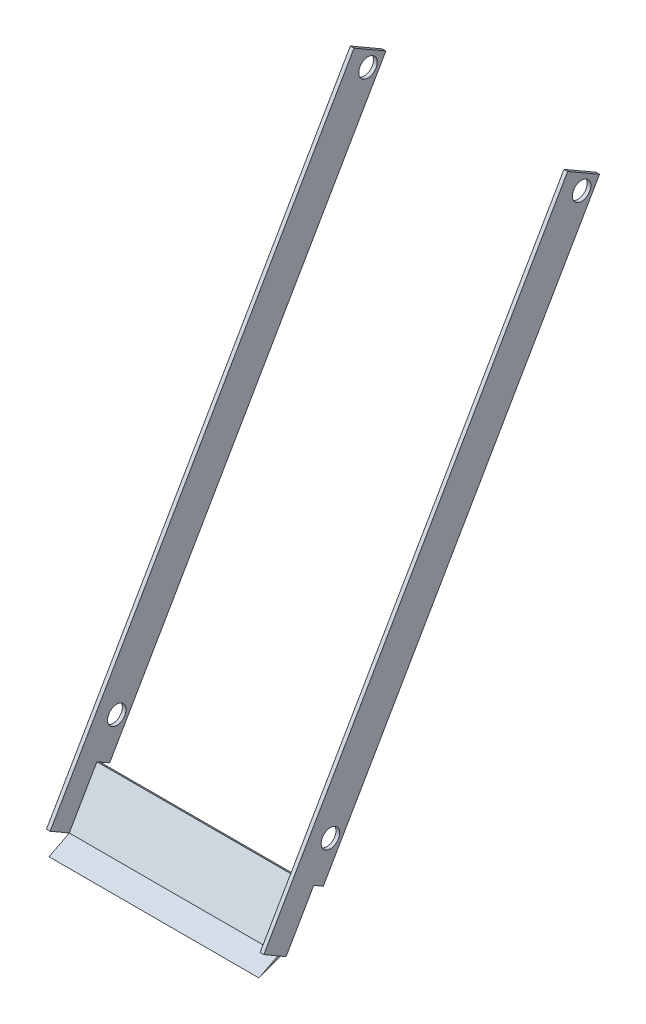
ISO-10303-21;
HEADER;
FILE_DESCRIPTION(('STEP AP214'),'2;1');
FILE_NAME('part.step','',(''),(''),'','','');
FILE_SCHEMA(('AUTOMOTIVE_DESIGN { 1 0 10303 214 1 1 1 1 }'));
ENDSEC;
DATA;
#1=APPLICATION_CONTEXT('core data for automotive mechanical design processes');
#2=APPLICATION_PROTOCOL_DEFINITION('international standard','automotive_design',2000,#1);
#3=PRODUCT_CONTEXT('',#1,'mechanical');
#4=PRODUCT('Part','Part','',(#3));
#5=PRODUCT_RELATED_PRODUCT_CATEGORY('part','',(#4));
#6=PRODUCT_DEFINITION_FORMATION('','',#4);
#7=PRODUCT_DEFINITION_CONTEXT('part definition',#1,'design');
#8=PRODUCT_DEFINITION('design','',#6,#7);
#9=PRODUCT_DEFINITION_SHAPE('','',#8);
#10=(LENGTH_UNIT() NAMED_UNIT(*) SI_UNIT(.MILLI.,.METRE.));
#11=(NAMED_UNIT(*) PLANE_ANGLE_UNIT() SI_UNIT($,.RADIAN.));
#12=(NAMED_UNIT(*) SI_UNIT($,.STERADIAN.) SOLID_ANGLE_UNIT());
#13=UNCERTAINTY_MEASURE_WITH_UNIT(LENGTH_MEASURE(1.E-05),#10,'distance_accuracy_value','');
#14=(GEOMETRIC_REPRESENTATION_CONTEXT(3) GLOBAL_UNCERTAINTY_ASSIGNED_CONTEXT((#13)) GLOBAL_UNIT_ASSIGNED_CONTEXT((#10,
#11,#12)) REPRESENTATION_CONTEXT('',''));
#15=CARTESIAN_POINT('',(0.,0.,0.));
#16=DIRECTION('',(0.,0.,1.));
#17=DIRECTION('',(1.,0.,0.));
#18=AXIS2_PLACEMENT_3D('',#15,#16,#17);
#19=CARTESIAN_POINT('',(1140.,-4.99999999999966,-8.66025403784386));
#20=DIRECTION('',(0.,-0.499999999999998,-0.86602540378444));
#21=DIRECTION('',(0.,0.86602540378444,-0.499999999999998));
#22=AXIS2_PLACEMENT_3D('',#19,#20,#21);
#23=PLANE('',#22);
#24=DIRECTION('',(0.,-0.86602540378444,0.499999999999998));
#25=VECTOR('',#24,1.);
#26=CARTESIAN_POINT('',(-20.,-5.04103145921631,-8.63656451381988));
#27=LINE('',#26,#25);
#28=CARTESIAN_POINT('',(-20.,254.807621135332,-158.660254037843));
#29=VERTEX_POINT('',#28);
#30=CARTESIAN_POINT('',(-20.,-5.04103145921631,-8.63656451381988));
#31=VERTEX_POINT('',#30);
#32=EDGE_CURVE('E144',#29,#31,#27,.T.);
#33=ORIENTED_EDGE('',*,*,#32,.F.);
#34=DIRECTION('',(-1.,0.,0.));
#35=VECTOR('',#34,1.);
#36=CARTESIAN_POINT('',(0.,254.807621135332,-158.660254037843));
#37=LINE('',#36,#35);
#38=CARTESIAN_POINT('',(0.,254.807621135332,-158.660254037843));
#39=VERTEX_POINT('',#38);
#40=EDGE_CURVE('E280',#39,#29,#37,.T.);
#41=ORIENTED_EDGE('',*,*,#40,.F.);
#42=DIRECTION('',(-1.,0.,0.));
#43=VECTOR('',#42,1.);
#44=CARTESIAN_POINT('',(1140.,254.807621135332,-158.660254037843));
#45=LINE('',#44,#43);
#46=CARTESIAN_POINT('',(1140.,254.807621135332,-158.660254037843));
#47=VERTEX_POINT('',#46);
#48=EDGE_CURVE('E112',#47,#39,#45,.T.);
#49=ORIENTED_EDGE('',*,*,#48,.F.);
#50=DIRECTION('',(-1.,0.,0.));
#51=VECTOR('',#50,1.);
#52=CARTESIAN_POINT('',(1160.,254.807621135332,-158.660254037843));
#53=LINE('',#52,#51);
#54=CARTESIAN_POINT('',(1160.,254.807621135332,-158.660254037843));
#55=VERTEX_POINT('',#54);
#56=EDGE_CURVE('E283',#55,#47,#53,.T.);
#57=ORIENTED_EDGE('',*,*,#56,.F.);
#58=DIRECTION('',(0.,0.86602540378444,-0.499999999999998));
#59=VECTOR('',#58,1.);
#60=CARTESIAN_POINT('',(1160.,-5.04103145921631,-8.63656451381988));
#61=LINE('',#60,#59);
#62=CARTESIAN_POINT('',(1160.,-5.04103145921631,-8.63656451381988));
#63=VERTEX_POINT('',#62);
#64=EDGE_CURVE('E166',#63,#55,#61,.T.);
#65=ORIENTED_EDGE('',*,*,#64,.F.);
#66=DIRECTION('',(-1.,0.,0.));
#67=VECTOR('',#66,1.);
#68=CARTESIAN_POINT('',(1160.,-5.04103145921631,-8.63656451381988));
#69=LINE('',#68,#67);
#70=CARTESIAN_POINT('',(1140.,-5.04103145921631,-8.63656451381988));
#71=VERTEX_POINT('',#70);
#72=EDGE_CURVE('E175',#63,#71,#69,.T.);
#73=ORIENTED_EDGE('',*,*,#72,.T.);
#74=DIRECTION('',(-1.,0.,0.));
#75=VECTOR('',#74,1.);
#76=CARTESIAN_POINT('',(1140.,-5.04103145921631,-8.63656451381988));
#77=LINE('',#76,#75);
#78=CARTESIAN_POINT('',(0.,-5.04103145921631,-8.63656451381988));
#79=VERTEX_POINT('',#78);
#80=EDGE_CURVE('E45',#71,#79,#77,.T.);
#81=ORIENTED_EDGE('',*,*,#80,.T.);
#82=DIRECTION('',(1.,0.,0.));
#83=VECTOR('',#82,1.);
#84=CARTESIAN_POINT('',(-20.,-5.04103145921631,-8.63656451381988));
#85=LINE('',#84,#83);
#86=EDGE_CURVE('E161',#31,#79,#85,.T.);
#87=ORIENTED_EDGE('',*,*,#86,.F.);
#88=EDGE_LOOP('',(#33,#41,#49,#57,#65,#73,#81,#87));
#89=FACE_BOUND('',#88,.T.);
#90=ADVANCED_FACE('F41',(#89),#23,.T.);
#91=CARTESIAN_POINT('',(1140.,259.807621135332,-149.999999999999));
#92=DIRECTION('',(0.,-0.86602540378444,0.499999999999998));
#93=DIRECTION('',(0.,-0.499999999999998,-0.86602540378444));
#94=AXIS2_PLACEMENT_3D('',#91,#92,#93);
#95=PLANE('',#94);
#96=DIRECTION('',(0.,-0.499999999999998,-0.86602540378444));
#97=VECTOR('',#96,1.);
#98=CARTESIAN_POINT('',(0.,324.807621135332,-37.4166975080214));
#99=LINE('',#98,#97);
#100=CARTESIAN_POINT('',(0.,264.807621135332,-141.339745962155));
#101=VERTEX_POINT('',#100);
#102=EDGE_CURVE('E108',#101,#39,#99,.T.);
#103=ORIENTED_EDGE('',*,*,#102,.F.);
#104=DIRECTION('',(-1.,0.,0.));
#105=VECTOR('',#104,1.);
#106=CARTESIAN_POINT('',(1140.,264.807621135331,-141.339745962156));
#107=LINE('',#106,#105);
#108=CARTESIAN_POINT('',(1140.,264.807621135331,-141.339745962156));
#109=VERTEX_POINT('',#108);
#110=EDGE_CURVE('E98',#109,#101,#107,.T.);
#111=ORIENTED_EDGE('',*,*,#110,.F.);
#112=DIRECTION('',(0.,0.499999999999998,0.86602540378444));
#113=VECTOR('',#112,1.);
#114=CARTESIAN_POINT('',(1140.,324.807621135332,-37.4166975080214));
#115=LINE('',#114,#113);
#116=EDGE_CURVE('E104',#47,#109,#115,.T.);
#117=ORIENTED_EDGE('',*,*,#116,.F.);
#118=ORIENTED_EDGE('',*,*,#48,.T.);
#119=EDGE_LOOP('',(#103,#111,#117,#118));
#120=FACE_BOUND('',#119,.T.);
#121=ADVANCED_FACE('F100',(#120),#95,.F.);
#122=CARTESIAN_POINT('',(0.,0.,0.));
#123=DIRECTION('',(1.,0.,0.));
#124=DIRECTION('',(0.,0.,-1.));
#125=AXIS2_PLACEMENT_3D('',#122,#123,#124);
#126=PLANE('',#125);
#127=DIRECTION('',(0.,0.499999999999997,0.86602540378444));
#128=VECTOR('',#127,1.);
#129=CARTESIAN_POINT('',(0.,64.9589685407834,112.606992016002));
#130=LINE('',#129,#128);
#131=CARTESIAN_POINT('',(0.,4.95896854078304,8.68394356186788));
#132=VERTEX_POINT('',#131);
#133=EDGE_CURVE('E72',#79,#132,#130,.T.);
#134=ORIENTED_EDGE('',*,*,#133,.F.);
#135=DIRECTION('',(0.,-0.346036376698013,0.938221096544791));
#136=VECTOR('',#135,1.);
#137=CARTESIAN_POINT('',(0.,-7.24134762664055,-2.67076673543316));
#138=LINE('',#137,#136);
#139=CARTESIAN_POINT('',(0.,-51.9835726598209,118.640466011402));
#140=VERTEX_POINT('',#139);
#141=EDGE_CURVE('E178',#79,#140,#138,.T.);
#142=ORIENTED_EDGE('',*,*,#141,.T.);
#143=DIRECTION('',(0.,-0.459859155191611,0.887991867860544));
#144=VECTOR('',#143,1.);
#145=CARTESIAN_POINT('',(0.,7.45639195742674,3.86139809431034));
#146=LINE('',#145,#144);
#147=EDGE_CURVE('E180',#132,#140,#146,.T.);
#148=ORIENTED_EDGE('',*,*,#147,.F.);
#149=EDGE_LOOP('',(#134,#142,#148));
#150=FACE_BOUND('',#149,.T.);
#151=ADVANCED_FACE('F342',(#150),#126,.F.);
#152=CARTESIAN_POINT('',(1140.,-7.24134762664055,-2.67076673543316));
#153=DIRECTION('',(0.,-0.938221096544791,-0.346036376698013));
#154=DIRECTION('',(0.,0.346036376698013,-0.938221096544791));
#155=AXIS2_PLACEMENT_3D('',#152,#153,#154);
#156=PLANE('',#155);
#157=ORIENTED_EDGE('',*,*,#141,.F.);
#158=ORIENTED_EDGE('',*,*,#80,.F.);
#159=DIRECTION('',(0.,-0.346036376698013,0.938221096544791));
#160=VECTOR('',#159,1.);
#161=CARTESIAN_POINT('',(1140.,-7.24134762664055,-2.67076673543316));
#162=LINE('',#161,#160);
#163=CARTESIAN_POINT('',(1140.,-51.9835726598209,118.640466011402));
#164=VERTEX_POINT('',#163);
#165=EDGE_CURVE('E123',#71,#164,#162,.T.);
#166=ORIENTED_EDGE('',*,*,#165,.T.);
#167=DIRECTION('',(-1.,0.,0.));
#168=VECTOR('',#167,1.);
#169=CARTESIAN_POINT('',(1140.,-51.9835726598209,118.640466011402));
#170=LINE('',#169,#168);
#171=EDGE_CURVE('E183',#164,#140,#170,.T.);
#172=ORIENTED_EDGE('',*,*,#171,.T.);
#173=EDGE_LOOP('',(#157,#158,#166,#172));
#174=FACE_BOUND('',#173,.T.);
#175=ADVANCED_FACE('F43',(#174),#156,.T.);
#176=CARTESIAN_POINT('',(1140.,4.99999999999968,8.66025403784388));
#177=DIRECTION('',(0.,-0.499999999999998,-0.86602540378444));
#178=DIRECTION('',(0.,0.86602540378444,-0.499999999999998));
#179=AXIS2_PLACEMENT_3D('',#176,#177,#178);
#180=PLANE('',#179);
#181=DIRECTION('',(0.,-0.86602540378444,0.499999999999998));
#182=VECTOR('',#181,1.);
#183=CARTESIAN_POINT('',(0.,4.99999999999968,8.66025403784388));
#184=LINE('',#183,#182);
#185=EDGE_CURVE('E185',#101,#132,#184,.T.);
#186=ORIENTED_EDGE('',*,*,#185,.T.);
#187=DIRECTION('',(-1.,0.,0.));
#188=VECTOR('',#187,1.);
#189=CARTESIAN_POINT('',(1140.,4.95896854078302,8.68394356186786));
#190=LINE('',#189,#188);
#191=CARTESIAN_POINT('',(1140.,4.95896854078302,8.68394356186786));
#192=VERTEX_POINT('',#191);
#193=EDGE_CURVE('E113',#192,#132,#190,.T.);
#194=ORIENTED_EDGE('',*,*,#193,.F.);
#195=DIRECTION('',(0.,-0.86602540378444,0.499999999999998));
#196=VECTOR('',#195,1.);
#197=CARTESIAN_POINT('',(1140.,4.99999999999968,8.66025403784388));
#198=LINE('',#197,#196);
#199=EDGE_CURVE('E117',#109,#192,#198,.T.);
#200=ORIENTED_EDGE('',*,*,#199,.F.);
#201=ORIENTED_EDGE('',*,*,#110,.T.);
#202=EDGE_LOOP('',(#186,#194,#200,#201));
#203=FACE_BOUND('',#202,.T.);
#204=ADVANCED_FACE('F118',(#203),#180,.F.);
#205=CARTESIAN_POINT('',(1140.,7.45639195742674,3.86139809431034));
#206=DIRECTION('',(0.,-0.887991867860544,-0.459859155191611));
#207=DIRECTION('',(0.,0.459859155191611,-0.887991867860544));
#208=AXIS2_PLACEMENT_3D('',#205,#206,#207);
#209=PLANE('',#208);
#210=ORIENTED_EDGE('',*,*,#147,.T.);
#211=ORIENTED_EDGE('',*,*,#171,.F.);
#212=DIRECTION('',(0.,-0.459859155191611,0.887991867860544));
#213=VECTOR('',#212,1.);
#214=CARTESIAN_POINT('',(1140.,7.45639195742674,3.86139809431034));
#215=LINE('',#214,#213);
#216=EDGE_CURVE('E60',#192,#164,#215,.T.);
#217=ORIENTED_EDGE('',*,*,#216,.F.);
#218=ORIENTED_EDGE('',*,*,#193,.T.);
#219=EDGE_LOOP('',(#210,#211,#217,#218));
#220=FACE_BOUND('',#219,.T.);
#221=ADVANCED_FACE('F326',(#220),#209,.F.);
#222=CARTESIAN_POINT('',(1140.,0.,0.));
#223=DIRECTION('',(1.,0.,0.));
#224=DIRECTION('',(0.,0.,-1.));
#225=AXIS2_PLACEMENT_3D('',#222,#223,#224);
#226=PLANE('',#225);
#227=DIRECTION('',(0.,-0.499999999999997,-0.86602540378444));
#228=VECTOR('',#227,1.);
#229=CARTESIAN_POINT('',(1140.,-5.04103145921631,-8.63656451381988));
#230=LINE('',#229,#228);
#231=EDGE_CURVE('E11',#192,#71,#230,.T.);
#232=ORIENTED_EDGE('',*,*,#231,.F.);
#233=ORIENTED_EDGE('',*,*,#216,.T.);
#234=ORIENTED_EDGE('',*,*,#165,.F.);
#235=EDGE_LOOP('',(#232,#233,#234));
#236=FACE_BOUND('',#235,.T.);
#237=ADVANCED_FACE('F324',(#236),#226,.T.);
#238=CARTESIAN_POINT('',(1160.,-5.04103145921631,-8.63656451381988));
#239=DIRECTION('',(0.,0.86602540378444,-0.499999999999998));
#240=DIRECTION('',(0.,0.499999999999998,0.86602540378444));
#241=AXIS2_PLACEMENT_3D('',#238,#239,#240);
#242=PLANE('',#241);
#243=CARTESIAN_POINT('',(1140.,64.9589685407834,112.606992016002));
#244=VERTEX_POINT('',#243);
#245=EDGE_CURVE('E52',#244,#192,#230,.T.);
#246=ORIENTED_EDGE('',*,*,#245,.T.);
#247=ORIENTED_EDGE('',*,*,#231,.T.);
#248=ORIENTED_EDGE('',*,*,#72,.F.);
#249=DIRECTION('',(0.,-0.499999999999997,-0.86602540378444));
#250=VECTOR('',#249,1.);
#251=CARTESIAN_POINT('',(1160.,-5.04103145921631,-8.63656451381988));
#252=LINE('',#251,#250);
#253=CARTESIAN_POINT('',(1160.,64.9589685407834,112.606992016002));
#254=VERTEX_POINT('',#253);
#255=EDGE_CURVE('E164',#254,#63,#252,.T.);
#256=ORIENTED_EDGE('',*,*,#255,.F.);
#257=DIRECTION('',(-1.,0.,0.));
#258=VECTOR('',#257,1.);
#259=CARTESIAN_POINT('',(1160.,64.9589685407834,112.606992016002));
#260=LINE('',#259,#258);
#261=EDGE_CURVE('E170',#254,#244,#260,.T.);
#262=ORIENTED_EDGE('',*,*,#261,.T.);
#263=EDGE_LOOP('',(#246,#247,#248,#256,#262));
#264=FACE_BOUND('',#263,.T.);
#265=ADVANCED_FACE('F323',(#264),#242,.F.);
#266=CARTESIAN_POINT('',(1160.,64.9589685407834,112.606992016002));
#267=DIRECTION('',(0.,-0.499999999999998,-0.86602540378444));
#268=DIRECTION('',(0.,0.86602540378444,-0.499999999999998));
#269=AXIS2_PLACEMENT_3D('',#266,#267,#268);
#270=PLANE('',#269);
#271=DIRECTION('',(0.,-0.86602540378444,0.499999999999997));
#272=VECTOR('',#271,1.);
#273=CARTESIAN_POINT('',(1140.,64.9589685407834,112.606992016002));
#274=LINE('',#273,#272);
#275=CARTESIAN_POINT('',(1140.,2922.71062740789,-1537.31669750802));
#276=VERTEX_POINT('',#275);
#277=EDGE_CURVE('E167',#276,#244,#274,.T.);
#278=ORIENTED_EDGE('',*,*,#277,.T.);
#279=ORIENTED_EDGE('',*,*,#261,.F.);
#280=DIRECTION('',(0.,-0.86602540378444,0.499999999999997));
#281=VECTOR('',#280,1.);
#282=CARTESIAN_POINT('',(1160.,64.9589685407834,112.606992016002));
#283=LINE('',#282,#281);
#284=CARTESIAN_POINT('',(1160.,2922.71062740789,-1537.31669750802));
#285=VERTEX_POINT('',#284);
#286=EDGE_CURVE('E82',#285,#254,#283,.T.);
#287=ORIENTED_EDGE('',*,*,#286,.F.);
#288=DIRECTION('',(1.,0.,0.));
#289=VECTOR('',#288,1.);
#290=CARTESIAN_POINT('',(1160.,2922.71062740789,-1537.31669750802));
#291=LINE('',#290,#289);
#292=EDGE_CURVE('E131',#276,#285,#291,.T.);
#293=ORIENTED_EDGE('',*,*,#292,.F.);
#294=EDGE_LOOP('',(#278,#279,#287,#293));
#295=FACE_BOUND('',#294,.T.);
#296=ADVANCED_FACE('F312',(#295),#270,.F.);
#297=CARTESIAN_POINT('',(1160.,0.,0.));
#298=DIRECTION('',(-1.,0.,0.));
#299=DIRECTION('',(0.,0.,1.));
#300=AXIS2_PLACEMENT_3D('',#297,#298,#299);
#301=PLANE('',#300);
#302=CARTESIAN_POINT('',(1160.,431.627061246165,-249.199999999999));
#303=DIRECTION('',(1.,0.,0.));
#304=DIRECTION('',(0.,0.,-1.));
#305=AXIS2_PLACEMENT_3D('',#302,#303,#304);
#306=CIRCLE('',#305,50.);
#307=CARTESIAN_POINT('',(1160.,431.627061246165,-299.199999999999));
#308=VERTEX_POINT('',#307);
#309=EDGE_CURVE('E595',#308,#308,#306,.T.);
#310=ORIENTED_EDGE('',*,*,#309,.F.);
#311=EDGE_LOOP('',(#310));
#312=FACE_BOUND('',#311,.T.);
#313=CARTESIAN_POINT('',(1160.,2794.14436277011,-1613.2));
#314=DIRECTION('',(1.,0.,0.));
#315=DIRECTION('',(0.,0.,-1.));
#316=AXIS2_PLACEMENT_3D('',#313,#314,#315);
#317=CIRCLE('',#316,50.);
#318=CARTESIAN_POINT('',(1160.,2794.14436277011,-1663.2));
#319=VERTEX_POINT('',#318);
#320=EDGE_CURVE('E603',#319,#319,#317,.T.);
#321=ORIENTED_EDGE('',*,*,#320,.F.);
#322=EDGE_LOOP('',(#321));
#323=FACE_BOUND('',#322,.T.);
#324=ORIENTED_EDGE('',*,*,#255,.T.);
#325=ORIENTED_EDGE('',*,*,#64,.T.);
#326=DIRECTION('',(0.,0.499999999999998,0.86602540378444));
#327=VECTOR('',#326,1.);
#328=CARTESIAN_POINT('',(1160.,224.807621135332,-210.621778264909));
#329=LINE('',#328,#327);
#330=CARTESIAN_POINT('',(1160.,224.807621135332,-210.621778264909));
#331=VERTEX_POINT('',#330);
#332=EDGE_CURVE('E301',#331,#55,#329,.T.);
#333=ORIENTED_EDGE('',*,*,#332,.F.);
#334=DIRECTION('',(0.,-0.86602540378444,0.499999999999998));
#335=VECTOR('',#334,1.);
#336=CARTESIAN_POINT('',(1160.,2822.7106274079,-1710.5217782649));
#337=LINE('',#336,#335);
#338=CARTESIAN_POINT('',(1160.,2822.7106274079,-1710.5217782649));
#339=VERTEX_POINT('',#338);
#340=EDGE_CURVE('E285',#339,#331,#337,.T.);
#341=ORIENTED_EDGE('',*,*,#340,.F.);
#342=DIRECTION('',(0.,-0.499999999999998,-0.86602540378444));
#343=VECTOR('',#342,1.);
#344=CARTESIAN_POINT('',(1160.,2852.71062740789,-1658.56025403784));
#345=LINE('',#344,#343);
#346=EDGE_CURVE('E135',#285,#339,#345,.T.);
#347=ORIENTED_EDGE('',*,*,#346,.F.);
#348=ORIENTED_EDGE('',*,*,#286,.T.);
#349=EDGE_LOOP('',(#324,#325,#333,#341,#347,#348));
#350=FACE_BOUND('',#349,.T.);
#351=ADVANCED_FACE('F315',(#312,#323,#350),#301,.F.);
#352=CARTESIAN_POINT('',(1140.,0.,0.));
#353=DIRECTION('',(-1.,0.,0.));
#354=DIRECTION('',(0.,0.,1.));
#355=AXIS2_PLACEMENT_3D('',#352,#353,#354);
#356=PLANE('',#355);
#357=CARTESIAN_POINT('',(1140.,431.627061246165,-249.199999999999));
#358=DIRECTION('',(-1.,0.,0.));
#359=DIRECTION('',(0.,0.,1.));
#360=AXIS2_PLACEMENT_3D('',#357,#358,#359);
#361=CIRCLE('',#360,50.);
#362=CARTESIAN_POINT('',(1140.,431.627061246165,-199.199999999999));
#363=VERTEX_POINT('',#362);
#364=EDGE_CURVE('E592',#363,#363,#361,.T.);
#365=ORIENTED_EDGE('',*,*,#364,.F.);
#366=EDGE_LOOP('',(#365));
#367=FACE_BOUND('',#366,.T.);
#368=CARTESIAN_POINT('',(1140.,2794.14436277011,-1613.2));
#369=DIRECTION('',(-1.,0.,0.));
#370=DIRECTION('',(0.,0.,1.));
#371=AXIS2_PLACEMENT_3D('',#368,#369,#370);
#372=CIRCLE('',#371,50.);
#373=CARTESIAN_POINT('',(1140.,2794.14436277011,-1563.2));
#374=VERTEX_POINT('',#373);
#375=EDGE_CURVE('E610',#374,#374,#372,.T.);
#376=ORIENTED_EDGE('',*,*,#375,.F.);
#377=EDGE_LOOP('',(#376));
#378=FACE_BOUND('',#377,.T.);
#379=ORIENTED_EDGE('',*,*,#277,.F.);
#380=DIRECTION('',(0.,0.499999999999998,0.86602540378444));
#381=VECTOR('',#380,1.);
#382=CARTESIAN_POINT('',(1140.,2922.71062740789,-1537.31669750802));
#383=LINE('',#382,#381);
#384=CARTESIAN_POINT('',(1140.,2822.7106274079,-1710.5217782649));
#385=VERTEX_POINT('',#384);
#386=EDGE_CURVE('E142',#385,#276,#383,.T.);
#387=ORIENTED_EDGE('',*,*,#386,.F.);
#388=DIRECTION('',(0.,0.86602540378444,-0.499999999999998));
#389=VECTOR('',#388,1.);
#390=CARTESIAN_POINT('',(1140.,2822.7106274079,-1710.5217782649));
#391=LINE('',#390,#389);
#392=CARTESIAN_POINT('',(1140.,224.807621135332,-210.621778264909));
#393=VERTEX_POINT('',#392);
#394=EDGE_CURVE('E294',#393,#385,#391,.T.);
#395=ORIENTED_EDGE('',*,*,#394,.F.);
#396=DIRECTION('',(0.,0.499999999999998,0.86602540378444));
#397=VECTOR('',#396,1.);
#398=CARTESIAN_POINT('',(1140.,224.807621135332,-210.621778264909));
#399=LINE('',#398,#397);
#400=EDGE_CURVE('E130',#393,#47,#399,.T.);
#401=ORIENTED_EDGE('',*,*,#400,.T.);
#402=ORIENTED_EDGE('',*,*,#116,.T.);
#403=ORIENTED_EDGE('',*,*,#199,.T.);
#404=ORIENTED_EDGE('',*,*,#245,.F.);
#405=EDGE_LOOP('',(#379,#387,#395,#401,#402,#403,#404));
#406=FACE_BOUND('',#405,.T.);
#407=ADVANCED_FACE('F127',(#367,#378,#406),#356,.T.);
#408=CARTESIAN_POINT('',(0.,0.,0.));
#409=DIRECTION('',(1.,0.,0.));
#410=DIRECTION('',(0.,0.,-1.));
#411=AXIS2_PLACEMENT_3D('',#408,#409,#410);
#412=PLANE('',#411);
#413=CARTESIAN_POINT('',(0.,431.627061246165,-249.199999999999));
#414=DIRECTION('',(1.,0.,0.));
#415=DIRECTION('',(0.,0.,-1.));
#416=AXIS2_PLACEMENT_3D('',#413,#414,#415);
#417=CIRCLE('',#416,50.);
#418=CARTESIAN_POINT('',(0.,431.627061246165,-299.199999999999));
#419=VERTEX_POINT('',#418);
#420=EDGE_CURVE('E613',#419,#419,#417,.T.);
#421=ORIENTED_EDGE('',*,*,#420,.F.);
#422=EDGE_LOOP('',(#421));
#423=FACE_BOUND('',#422,.T.);
#424=CARTESIAN_POINT('',(0.,2794.14436277011,-1613.2));
#425=DIRECTION('',(1.,0.,0.));
#426=DIRECTION('',(0.,0.,-1.));
#427=AXIS2_PLACEMENT_3D('',#424,#425,#426);
#428=CIRCLE('',#427,50.);
#429=CARTESIAN_POINT('',(0.,2794.14436277011,-1663.2));
#430=VERTEX_POINT('',#429);
#431=EDGE_CURVE('E600',#430,#430,#428,.T.);
#432=ORIENTED_EDGE('',*,*,#431,.F.);
#433=EDGE_LOOP('',(#432));
#434=FACE_BOUND('',#433,.T.);
#435=ORIENTED_EDGE('',*,*,#185,.F.);
#436=ORIENTED_EDGE('',*,*,#102,.T.);
#437=DIRECTION('',(0.,0.499999999999998,0.86602540378444));
#438=VECTOR('',#437,1.);
#439=CARTESIAN_POINT('',(0.,224.807621135332,-210.621778264909));
#440=LINE('',#439,#438);
#441=CARTESIAN_POINT('',(0.,224.807621135332,-210.621778264909));
#442=VERTEX_POINT('',#441);
#443=EDGE_CURVE('E264',#442,#39,#440,.T.);
#444=ORIENTED_EDGE('',*,*,#443,.F.);
#445=DIRECTION('',(0.,-0.86602540378444,0.499999999999998));
#446=VECTOR('',#445,1.);
#447=CARTESIAN_POINT('',(0.,2822.7106274079,-1710.5217782649));
#448=LINE('',#447,#446);
#449=CARTESIAN_POINT('',(0.,2822.7106274079,-1710.5217782649));
#450=VERTEX_POINT('',#449);
#451=EDGE_CURVE('E271',#450,#442,#448,.T.);
#452=ORIENTED_EDGE('',*,*,#451,.F.);
#453=DIRECTION('',(0.,-0.499999999999998,-0.86602540378444));
#454=VECTOR('',#453,1.);
#455=CARTESIAN_POINT('',(0.,2922.71062740789,-1537.31669750802));
#456=LINE('',#455,#454);
#457=CARTESIAN_POINT('',(0.,2922.71062740789,-1537.31669750802));
#458=VERTEX_POINT('',#457);
#459=EDGE_CURVE('E138',#458,#450,#456,.T.);
#460=ORIENTED_EDGE('',*,*,#459,.F.);
#461=DIRECTION('',(0.,0.86602540378444,-0.499999999999997));
#462=VECTOR('',#461,1.);
#463=CARTESIAN_POINT('',(0.,324.807621135332,-37.4166975080214));
#464=LINE('',#463,#462);
#465=CARTESIAN_POINT('',(0.,64.9589685407834,112.606992016002));
#466=VERTEX_POINT('',#465);
#467=EDGE_CURVE('E148',#466,#458,#464,.T.);
#468=ORIENTED_EDGE('',*,*,#467,.F.);
#469=EDGE_CURVE('E156',#132,#466,#130,.T.);
#470=ORIENTED_EDGE('',*,*,#469,.F.);
#471=EDGE_LOOP('',(#435,#436,#444,#452,#460,#468,#470));
#472=FACE_BOUND('',#471,.T.);
#473=ADVANCED_FACE('F282',(#423,#434,#472),#412,.T.);
#474=CARTESIAN_POINT('',(-20.,64.9589685407834,112.606992016002));
#475=DIRECTION('',(0.,0.86602540378444,-0.499999999999998));
#476=DIRECTION('',(0.,0.499999999999998,0.86602540378444));
#477=AXIS2_PLACEMENT_3D('',#474,#475,#476);
#478=PLANE('',#477);
#479=ORIENTED_EDGE('',*,*,#133,.T.);
#480=ORIENTED_EDGE('',*,*,#469,.T.);
#481=DIRECTION('',(1.,0.,0.));
#482=VECTOR('',#481,1.);
#483=CARTESIAN_POINT('',(-20.,64.9589685407834,112.606992016002));
#484=LINE('',#483,#482);
#485=CARTESIAN_POINT('',(-20.,64.9589685407834,112.606992016002));
#486=VERTEX_POINT('',#485);
#487=EDGE_CURVE('E154',#486,#466,#484,.T.);
#488=ORIENTED_EDGE('',*,*,#487,.F.);
#489=DIRECTION('',(0.,0.499999999999997,0.86602540378444));
#490=VECTOR('',#489,1.);
#491=CARTESIAN_POINT('',(-20.,64.9589685407834,112.606992016002));
#492=LINE('',#491,#490);
#493=EDGE_CURVE('E147',#31,#486,#492,.T.);
#494=ORIENTED_EDGE('',*,*,#493,.F.);
#495=ORIENTED_EDGE('',*,*,#86,.T.);
#496=EDGE_LOOP('',(#479,#480,#488,#494,#495));
#497=FACE_BOUND('',#496,.T.);
#498=ADVANCED_FACE('F201',(#497),#478,.F.);
#499=CARTESIAN_POINT('',(-20.,324.807621135332,-37.4166975080214));
#500=DIRECTION('',(0.,-0.499999999999998,-0.86602540378444));
#501=DIRECTION('',(0.,0.86602540378444,-0.499999999999998));
#502=AXIS2_PLACEMENT_3D('',#499,#500,#501);
#503=PLANE('',#502);
#504=ORIENTED_EDGE('',*,*,#467,.T.);
#505=DIRECTION('',(1.,0.,0.));
#506=VECTOR('',#505,1.);
#507=CARTESIAN_POINT('',(-20.,2922.71062740789,-1537.31669750802));
#508=LINE('',#507,#506);
#509=CARTESIAN_POINT('',(-20.,2922.71062740789,-1537.31669750802));
#510=VERTEX_POINT('',#509);
#511=EDGE_CURVE('E303',#510,#458,#508,.T.);
#512=ORIENTED_EDGE('',*,*,#511,.F.);
#513=DIRECTION('',(0.,0.86602540378444,-0.499999999999997));
#514=VECTOR('',#513,1.);
#515=CARTESIAN_POINT('',(-20.,324.807621135332,-37.4166975080214));
#516=LINE('',#515,#514);
#517=EDGE_CURVE('E151',#486,#510,#516,.T.);
#518=ORIENTED_EDGE('',*,*,#517,.F.);
#519=ORIENTED_EDGE('',*,*,#487,.T.);
#520=EDGE_LOOP('',(#504,#512,#518,#519));
#521=FACE_BOUND('',#520,.T.);
#522=ADVANCED_FACE('F406',(#521),#503,.F.);
#523=CARTESIAN_POINT('',(-20.,0.,0.));
#524=DIRECTION('',(1.,0.,0.));
#525=DIRECTION('',(0.,0.,-1.));
#526=AXIS2_PLACEMENT_3D('',#523,#524,#525);
#527=PLANE('',#526);
#528=CARTESIAN_POINT('',(-20.,431.627061246165,-249.199999999999));
#529=DIRECTION('',(1.,0.,0.));
#530=DIRECTION('',(0.,0.,-1.));
#531=AXIS2_PLACEMENT_3D('',#528,#529,#530);
#532=CIRCLE('',#531,50.);
#533=CARTESIAN_POINT('',(-20.,431.627061246165,-299.199999999999));
#534=VERTEX_POINT('',#533);
#535=EDGE_CURVE('E596',#534,#534,#532,.T.);
#536=ORIENTED_EDGE('',*,*,#535,.T.);
#537=EDGE_LOOP('',(#536));
#538=FACE_BOUND('',#537,.T.);
#539=CARTESIAN_POINT('',(-20.,2794.14436277011,-1613.2));
#540=DIRECTION('',(1.,0.,0.));
#541=DIRECTION('',(0.,0.,-1.));
#542=AXIS2_PLACEMENT_3D('',#539,#540,#541);
#543=CIRCLE('',#542,50.);
#544=CARTESIAN_POINT('',(-20.,2794.14436277011,-1663.2));
#545=VERTEX_POINT('',#544);
#546=EDGE_CURVE('E597',#545,#545,#543,.T.);
#547=ORIENTED_EDGE('',*,*,#546,.T.);
#548=EDGE_LOOP('',(#547));
#549=FACE_BOUND('',#548,.T.);
#550=DIRECTION('',(0.,0.499999999999998,0.86602540378444));
#551=VECTOR('',#550,1.);
#552=CARTESIAN_POINT('',(-20.,2922.71062740789,-1537.31669750802));
#553=LINE('',#552,#551);
#554=CARTESIAN_POINT('',(-20.,2822.7106274079,-1710.5217782649));
#555=VERTEX_POINT('',#554);
#556=EDGE_CURVE('E132',#555,#510,#553,.T.);
#557=ORIENTED_EDGE('',*,*,#556,.F.);
#558=DIRECTION('',(0.,0.86602540378444,-0.499999999999998));
#559=VECTOR('',#558,1.);
#560=CARTESIAN_POINT('',(-20.,2822.7106274079,-1710.5217782649));
#561=LINE('',#560,#559);
#562=CARTESIAN_POINT('',(-20.,224.807621135332,-210.621778264909));
#563=VERTEX_POINT('',#562);
#564=EDGE_CURVE('E270',#563,#555,#561,.T.);
#565=ORIENTED_EDGE('',*,*,#564,.F.);
#566=DIRECTION('',(0.,0.499999999999998,0.86602540378444));
#567=VECTOR('',#566,1.);
#568=CARTESIAN_POINT('',(-20.,224.807621135332,-210.621778264909));
#569=LINE('',#568,#567);
#570=EDGE_CURVE('E266',#563,#29,#569,.T.);
#571=ORIENTED_EDGE('',*,*,#570,.T.);
#572=ORIENTED_EDGE('',*,*,#32,.T.);
#573=ORIENTED_EDGE('',*,*,#493,.T.);
#574=ORIENTED_EDGE('',*,*,#517,.T.);
#575=EDGE_LOOP('',(#557,#565,#571,#572,#573,#574));
#576=FACE_BOUND('',#575,.T.);
#577=ADVANCED_FACE('F210',(#538,#549,#576),#527,.F.);
#578=CARTESIAN_POINT('',(0.,2857.71062740789,-1649.89999999999));
#579=DIRECTION('',(0.,-0.866025403784439,0.499999999999998));
#580=DIRECTION('',(0.,-0.499999999999998,-0.86602540378444));
#581=AXIS2_PLACEMENT_3D('',#578,#579,#580);
#582=PLANE('',#581);
#583=ORIENTED_EDGE('',*,*,#292,.T.);
#584=ORIENTED_EDGE('',*,*,#346,.T.);
#585=DIRECTION('',(1.,0.,0.));
#586=VECTOR('',#585,1.);
#587=CARTESIAN_POINT('',(1160.,2822.7106274079,-1710.5217782649));
#588=LINE('',#587,#586);
#589=EDGE_CURVE('E297',#385,#339,#588,.T.);
#590=ORIENTED_EDGE('',*,*,#589,.F.);
#591=ORIENTED_EDGE('',*,*,#386,.T.);
#592=EDGE_LOOP('',(#583,#584,#590,#591));
#593=FACE_BOUND('',#592,.T.);
#594=ADVANCED_FACE('F310',(#593),#582,.F.);
#595=CARTESIAN_POINT('',(0.,2857.71062740789,-1649.89999999999));
#596=DIRECTION('',(0.,0.86602540378444,-0.499999999999998));
#597=DIRECTION('',(0.,0.499999999999998,0.86602540378444));
#598=AXIS2_PLACEMENT_3D('',#595,#596,#597);
#599=PLANE('',#598);
#600=ORIENTED_EDGE('',*,*,#511,.T.);
#601=ORIENTED_EDGE('',*,*,#459,.T.);
#602=DIRECTION('',(1.,0.,0.));
#603=VECTOR('',#602,1.);
#604=CARTESIAN_POINT('',(0.,2822.7106274079,-1710.5217782649));
#605=LINE('',#604,#603);
#606=EDGE_CURVE('E277',#555,#450,#605,.T.);
#607=ORIENTED_EDGE('',*,*,#606,.F.);
#608=ORIENTED_EDGE('',*,*,#556,.T.);
#609=EDGE_LOOP('',(#600,#601,#607,#608));
#610=FACE_BOUND('',#609,.T.);
#611=ADVANCED_FACE('F461',(#610),#599,.T.);
#612=CARTESIAN_POINT('',(1160.,224.807621135332,-210.621778264909));
#613=DIRECTION('',(0.,0.86602540378444,-0.499999999999998));
#614=DIRECTION('',(0.,0.499999999999998,0.86602540378444));
#615=AXIS2_PLACEMENT_3D('',#612,#613,#614);
#616=PLANE('',#615);
#617=ORIENTED_EDGE('',*,*,#56,.T.);
#618=ORIENTED_EDGE('',*,*,#400,.F.);
#619=DIRECTION('',(-1.,0.,0.));
#620=VECTOR('',#619,1.);
#621=CARTESIAN_POINT('',(1160.,224.807621135332,-210.621778264909));
#622=LINE('',#621,#620);
#623=EDGE_CURVE('E292',#331,#393,#622,.T.);
#624=ORIENTED_EDGE('',*,*,#623,.F.);
#625=ORIENTED_EDGE('',*,*,#332,.T.);
#626=EDGE_LOOP('',(#617,#618,#624,#625));
#627=FACE_BOUND('',#626,.T.);
#628=ADVANCED_FACE('F320',(#627),#616,.F.);
#629=CARTESIAN_POINT('',(0.,-34.9999999999995,-60.6217782649103));
#630=DIRECTION('',(0.,-0.499999999999998,-0.86602540378444));
#631=DIRECTION('',(0.,0.86602540378444,-0.499999999999998));
#632=AXIS2_PLACEMENT_3D('',#629,#630,#631);
#633=PLANE('',#632);
#634=ORIENTED_EDGE('',*,*,#340,.T.);
#635=ORIENTED_EDGE('',*,*,#623,.T.);
#636=ORIENTED_EDGE('',*,*,#394,.T.);
#637=ORIENTED_EDGE('',*,*,#589,.T.);
#638=EDGE_LOOP('',(#634,#635,#636,#637));
#639=FACE_BOUND('',#638,.T.);
#640=ADVANCED_FACE('F318',(#639),#633,.T.);
#641=CARTESIAN_POINT('',(0.,224.807621135332,-210.621778264909));
#642=DIRECTION('',(0.,0.86602540378444,-0.499999999999998));
#643=DIRECTION('',(0.,0.499999999999998,0.86602540378444));
#644=AXIS2_PLACEMENT_3D('',#641,#642,#643);
#645=PLANE('',#644);
#646=ORIENTED_EDGE('',*,*,#40,.T.);
#647=ORIENTED_EDGE('',*,*,#570,.F.);
#648=DIRECTION('',(-1.,0.,0.));
#649=VECTOR('',#648,1.);
#650=CARTESIAN_POINT('',(0.,224.807621135332,-210.621778264909));
#651=LINE('',#650,#649);
#652=EDGE_CURVE('E260',#442,#563,#651,.T.);
#653=ORIENTED_EDGE('',*,*,#652,.F.);
#654=ORIENTED_EDGE('',*,*,#443,.T.);
#655=EDGE_LOOP('',(#646,#647,#653,#654));
#656=FACE_BOUND('',#655,.T.);
#657=ADVANCED_FACE('F262',(#656),#645,.F.);
#658=CARTESIAN_POINT('',(0.,-34.9999999999995,-60.6217782649103));
#659=DIRECTION('',(0.,-0.499999999999998,-0.86602540378444));
#660=DIRECTION('',(0.,0.86602540378444,-0.499999999999998));
#661=AXIS2_PLACEMENT_3D('',#658,#659,#660);
#662=PLANE('',#661);
#663=ORIENTED_EDGE('',*,*,#451,.T.);
#664=ORIENTED_EDGE('',*,*,#652,.T.);
#665=ORIENTED_EDGE('',*,*,#564,.T.);
#666=ORIENTED_EDGE('',*,*,#606,.T.);
#667=EDGE_LOOP('',(#663,#664,#665,#666));
#668=FACE_BOUND('',#667,.T.);
#669=ADVANCED_FACE('F275',(#668),#662,.T.);
#670=CARTESIAN_POINT('',(-20.,2794.14436277011,-1613.2));
#671=DIRECTION('',(1.,0.,0.));
#672=DIRECTION('',(0.,0.,-1.));
#673=AXIS2_PLACEMENT_3D('',#670,#671,#672);
#674=CYLINDRICAL_SURFACE('',#673,50.);
#675=ORIENTED_EDGE('',*,*,#431,.T.);
#676=EDGE_LOOP('',(#675));
#677=FACE_BOUND('',#676,.T.);
#678=ORIENTED_EDGE('',*,*,#546,.F.);
#679=EDGE_LOOP('',(#678));
#680=FACE_BOUND('',#679,.T.);
#681=ADVANCED_FACE('F503',(#677,#680),#674,.F.);
#682=CARTESIAN_POINT('',(-20.,431.627061246165,-249.199999999999));
#683=DIRECTION('',(1.,0.,0.));
#684=DIRECTION('',(0.,0.,-1.));
#685=AXIS2_PLACEMENT_3D('',#682,#683,#684);
#686=CYLINDRICAL_SURFACE('',#685,50.);
#687=ORIENTED_EDGE('',*,*,#420,.T.);
#688=EDGE_LOOP('',(#687));
#689=FACE_BOUND('',#688,.T.);
#690=ORIENTED_EDGE('',*,*,#535,.F.);
#691=EDGE_LOOP('',(#690));
#692=FACE_BOUND('',#691,.T.);
#693=ADVANCED_FACE('F527',(#689,#692),#686,.F.);
#694=ORIENTED_EDGE('',*,*,#375,.T.);
#695=EDGE_LOOP('',(#694));
#696=FACE_BOUND('',#695,.T.);
#697=ORIENTED_EDGE('',*,*,#320,.T.);
#698=EDGE_LOOP('',(#697));
#699=FACE_BOUND('',#698,.T.);
#700=ADVANCED_FACE('F530',(#696,#699),#674,.F.);
#701=ORIENTED_EDGE('',*,*,#364,.T.);
#702=EDGE_LOOP('',(#701));
#703=FACE_BOUND('',#702,.T.);
#704=ORIENTED_EDGE('',*,*,#309,.T.);
#705=EDGE_LOOP('',(#704));
#706=FACE_BOUND('',#705,.T.);
#707=ADVANCED_FACE('F540',(#703,#706),#686,.F.);
#708=CLOSED_SHELL('',(#90,#121,#151,#175,#204,#221,#237,#265,#296,#351,#407,#473,#498,#522,#577,
#594,#611,#628,#640,#657,#669,#681,#693,#700,#707));
#709=MANIFOLD_SOLID_BREP('B2',#708);
#710=ADVANCED_BREP_SHAPE_REPRESENTATION('',(#18,#709),#14);
#711=SHAPE_DEFINITION_REPRESENTATION(#9,#710);
ENDSEC;
END-ISO-10303-21;
